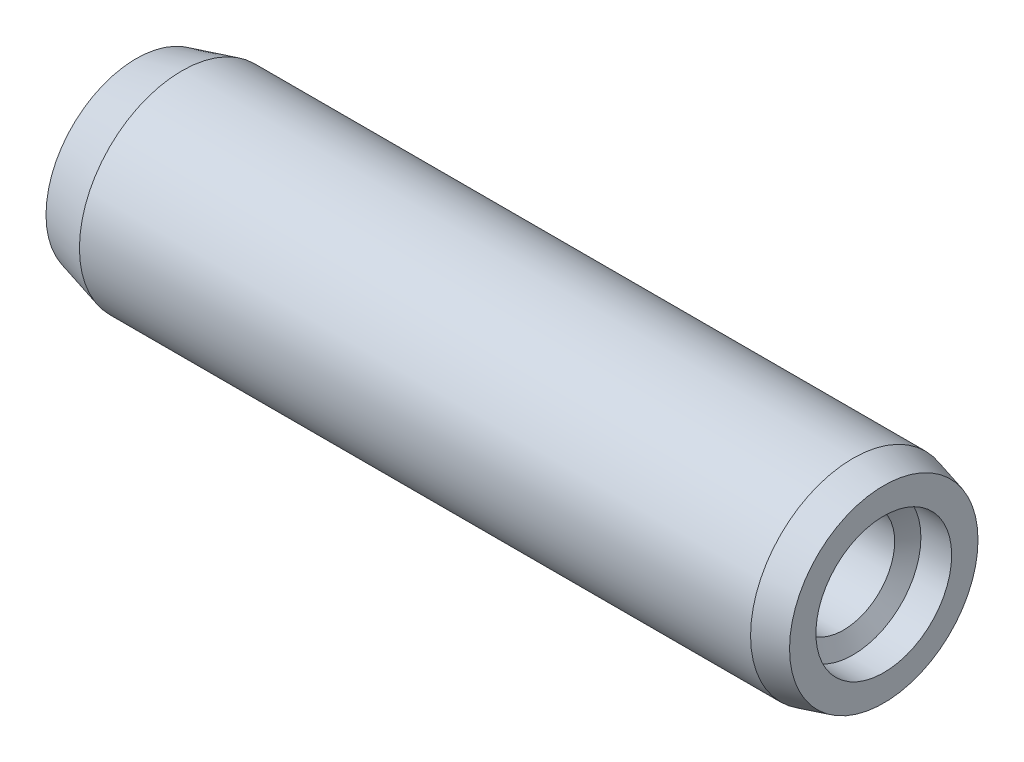
ISO-10303-21;
HEADER;
FILE_DESCRIPTION(('STEP AP214'),'2;1');
FILE_NAME('part.step','',(''),(''),'','','');
FILE_SCHEMA(('AUTOMOTIVE_DESIGN { 1 0 10303 214 1 1 1 1 }'));
ENDSEC;
DATA;
#1=APPLICATION_CONTEXT('core data for automotive mechanical design processes');
#2=APPLICATION_PROTOCOL_DEFINITION('international standard','automotive_design',2000,#1);
#3=PRODUCT_CONTEXT('',#1,'mechanical');
#4=PRODUCT('Part','Part','',(#3));
#5=PRODUCT_RELATED_PRODUCT_CATEGORY('part','',(#4));
#6=PRODUCT_DEFINITION_FORMATION('','',#4);
#7=PRODUCT_DEFINITION_CONTEXT('part definition',#1,'design');
#8=PRODUCT_DEFINITION('design','',#6,#7);
#9=PRODUCT_DEFINITION_SHAPE('','',#8);
#10=(LENGTH_UNIT() NAMED_UNIT(*) SI_UNIT(.MILLI.,.METRE.));
#11=(NAMED_UNIT(*) PLANE_ANGLE_UNIT() SI_UNIT($,.RADIAN.));
#12=(NAMED_UNIT(*) SI_UNIT($,.STERADIAN.) SOLID_ANGLE_UNIT());
#13=UNCERTAINTY_MEASURE_WITH_UNIT(LENGTH_MEASURE(1.E-05),#10,'distance_accuracy_value','');
#14=(GEOMETRIC_REPRESENTATION_CONTEXT(3) GLOBAL_UNCERTAINTY_ASSIGNED_CONTEXT((#13)) GLOBAL_UNIT_ASSIGNED_CONTEXT((#10,
#11,#12)) REPRESENTATION_CONTEXT('',''));
#15=CARTESIAN_POINT('',(0.,0.,0.));
#16=DIRECTION('',(0.,0.,1.));
#17=DIRECTION('',(1.,0.,0.));
#18=AXIS2_PLACEMENT_3D('',#15,#16,#17);
#19=CARTESIAN_POINT('',(8.,0.,0.));
#20=DIRECTION('',(0.,0.,1.00000000000001));
#21=DIRECTION('',(1.,0.,0.));
#22=AXIS2_PLACEMENT_3D('',#19,#20,#21);
#23=SPHERICAL_SURFACE('',#22,8.);
#24=CARTESIAN_POINT('',(8.,0.,0.));
#25=DIRECTION('',(-1.,0.,0.));
#26=DIRECTION('',(0.,0.,1.));
#27=AXIS2_PLACEMENT_3D('',#24,#25,#26);
#28=SPHERICAL_SURFACE('',#27,8.);
#29=CARTESIAN_POINT('',(0.817137041249985,0.,0.));
#30=DIRECTION('',(-1.,0.,0.));
#31=DIRECTION('',(0.,0.,1.00000000000001));
#32=AXIS2_PLACEMENT_3D('',#29,#30,#31);
#33=CIRCLE('',#32,3.52228330998757);
#34=CARTESIAN_POINT('',(0.817137041249985,0.,3.52228330998762));
#35=VERTEX_POINT('',#34);
#36=EDGE_CURVE('E58',#35,#35,#33,.T.);
#37=ORIENTED_EDGE('',*,*,#36,.T.);
#38=EDGE_LOOP('',(#37));
#39=FACE_BOUND('',#38,.T.);
#40=ADVANCED_FACE('F38',(#39),#28,.T.);
#41=CARTESIAN_POINT('',(30.,3.67846096908273,3.33066907387547E-13));
#42=DIRECTION('',(-1.,0.,0.));
#43=DIRECTION('',(0.,0.,1.00000000000001));
#44=AXIS2_PLACEMENT_3D('',#41,#42,#43);
#45=PLANE('',#44);
#46=CARTESIAN_POINT('',(30.0000000000001,0.,1.66533453693773E-13));
#47=DIRECTION('',(1.,0.,0.));
#48=DIRECTION('',(0.,0.,-1.00000000000001));
#49=AXIS2_PLACEMENT_3D('',#46,#47,#48);
#50=CIRCLE('',#49,2.65);
#51=CARTESIAN_POINT('',(30.0000000000001,0.,-2.64999999999987));
#52=VERTEX_POINT('',#51);
#53=EDGE_CURVE('E64',#52,#52,#50,.T.);
#54=ORIENTED_EDGE('',*,*,#53,.F.);
#55=EDGE_LOOP('',(#54));
#56=FACE_BOUND('',#55,.T.);
#57=CARTESIAN_POINT('',(30.0000000000001,0.,1.66533453693773E-13));
#58=DIRECTION('',(-1.,0.,0.));
#59=DIRECTION('',(0.,0.,1.00000000000001));
#60=AXIS2_PLACEMENT_3D('',#57,#58,#59);
#61=CIRCLE('',#60,3.67846096908265);
#62=CARTESIAN_POINT('',(30.0000000000001,0.,3.67846096908286));
#63=VERTEX_POINT('',#62);
#64=EDGE_CURVE('E11',#63,#63,#61,.T.);
#65=ORIENTED_EDGE('',*,*,#64,.F.);
#66=EDGE_LOOP('',(#65));
#67=FACE_BOUND('',#66,.T.);
#68=ADVANCED_FACE('F78',(#56,#67),#45,.F.);
#69=CARTESIAN_POINT('',(30.0000000000001,0.,1.66533453693773E-13));
#70=DIRECTION('',(-1.,0.,0.));
#71=DIRECTION('',(0.,0.,1.00000000000001));
#72=AXIS2_PLACEMENT_3D('',#69,#70,#71);
#73=CONICAL_SURFACE('',#72,3.67846096908265,0.261799387799152);
#74=CARTESIAN_POINT('',(28.8000000000001,0.,1.66533453693773E-13));
#75=DIRECTION('',(-1.,0.,0.));
#76=DIRECTION('',(0.,0.,1.00000000000001));
#77=AXIS2_PLACEMENT_3D('',#74,#75,#76);
#78=CIRCLE('',#77,4.);
#79=CARTESIAN_POINT('',(28.8000000000001,0.,4.00000000000022));
#80=VERTEX_POINT('',#79);
#81=EDGE_CURVE('E45',#80,#80,#78,.T.);
#82=ORIENTED_EDGE('',*,*,#81,.F.);
#83=EDGE_LOOP('',(#82));
#84=FACE_BOUND('',#83,.T.);
#85=ORIENTED_EDGE('',*,*,#64,.T.);
#86=EDGE_LOOP('',(#85));
#87=FACE_BOUND('',#86,.T.);
#88=ADVANCED_FACE('F75',(#84,#87),#73,.T.);
#89=CARTESIAN_POINT('',(-7.06251541307028,0.,2.22044604925031E-13));
#90=DIRECTION('',(-1.,0.,0.));
#91=DIRECTION('',(0.,0.,1.00000000000001));
#92=AXIS2_PLACEMENT_3D('',#89,#90,#91);
#93=CYLINDRICAL_SURFACE('',#92,4.);
#94=CARTESIAN_POINT('',(2.6,0.,0.));
#95=DIRECTION('',(-1.,0.,0.));
#96=DIRECTION('',(0.,0.,1.00000000000001));
#97=AXIS2_PLACEMENT_3D('',#94,#95,#96);
#98=CIRCLE('',#97,4.);
#99=CARTESIAN_POINT('',(2.6,0.,4.00000000000005));
#100=VERTEX_POINT('',#99);
#101=EDGE_CURVE('E61',#100,#100,#98,.T.);
#102=ORIENTED_EDGE('',*,*,#101,.F.);
#103=EDGE_LOOP('',(#102));
#104=FACE_BOUND('',#103,.T.);
#105=ORIENTED_EDGE('',*,*,#81,.T.);
#106=EDGE_LOOP('',(#105));
#107=FACE_BOUND('',#106,.T.);
#108=ADVANCED_FACE('F73',(#104,#107),#93,.T.);
#109=CARTESIAN_POINT('',(2.6,0.,0.));
#110=DIRECTION('',(1.,0.,0.));
#111=DIRECTION('',(0.,0.,-1.00000000000001));
#112=AXIS2_PLACEMENT_3D('',#109,#110,#111);
#113=CONICAL_SURFACE('',#112,4.,0.26179938779915);
#114=ORIENTED_EDGE('',*,*,#36,.F.);
#115=EDGE_LOOP('',(#114));
#116=FACE_BOUND('',#115,.T.);
#117=ORIENTED_EDGE('',*,*,#101,.T.);
#118=EDGE_LOOP('',(#117));
#119=FACE_BOUND('',#118,.T.);
#120=ADVANCED_FACE('F92',(#116,#119),#113,.T.);
#121=CARTESIAN_POINT('',(28.8000000000001,0.,1.66533453693773E-13));
#122=DIRECTION('',(1.,0.,0.));
#123=DIRECTION('',(0.,0.,-1.00000000000001));
#124=AXIS2_PLACEMENT_3D('',#121,#122,#123);
#125=CONICAL_SURFACE('',#124,2.65,1.0471975511966);
#126=CARTESIAN_POINT('',(28.8000000000001,0.,1.66533453693773E-13));
#127=DIRECTION('',(1.,0.,0.));
#128=DIRECTION('',(0.,0.,-1.00000000000001));
#129=AXIS2_PLACEMENT_3D('',#126,#127,#128);
#130=CIRCLE('',#129,2.65);
#131=CARTESIAN_POINT('',(28.8000000000001,0.,-2.64999999999987));
#132=VERTEX_POINT('',#131);
#133=EDGE_CURVE('E111',#132,#132,#130,.T.);
#134=ORIENTED_EDGE('',*,*,#133,.T.);
#135=EDGE_LOOP('',(#134));
#136=FACE_BOUND('',#135,.T.);
#137=CARTESIAN_POINT('',(28.4247223250268,0.,1.66533453693773E-13));
#138=DIRECTION('',(1.,0.,0.));
#139=DIRECTION('',(0.,0.,-1.00000000000001));
#140=AXIS2_PLACEMENT_3D('',#137,#138,#139);
#141=CIRCLE('',#140,2.);
#142=CARTESIAN_POINT('',(28.4247223250268,0.,-1.99999999999986));
#143=VERTEX_POINT('',#142);
#144=EDGE_CURVE('E41',#143,#143,#141,.T.);
#145=ORIENTED_EDGE('',*,*,#144,.F.);
#146=EDGE_LOOP('',(#145));
#147=FACE_BOUND('',#146,.T.);
#148=ADVANCED_FACE('F95',(#136,#147),#125,.F.);
#149=CARTESIAN_POINT('',(30.0000000000001,0.,1.66533453693773E-13));
#150=DIRECTION('',(1.,0.,0.));
#151=DIRECTION('',(0.,0.,-1.00000000000001));
#152=AXIS2_PLACEMENT_3D('',#149,#150,#151);
#153=CYLINDRICAL_SURFACE('',#152,2.65);
#154=ORIENTED_EDGE('',*,*,#133,.F.);
#155=EDGE_LOOP('',(#154));
#156=FACE_BOUND('',#155,.T.);
#157=ORIENTED_EDGE('',*,*,#53,.T.);
#158=EDGE_LOOP('',(#157));
#159=FACE_BOUND('',#158,.T.);
#160=ADVANCED_FACE('F52',(#156,#159),#153,.F.);
#161=CARTESIAN_POINT('',(18.,0.,1.66533453693773E-13));
#162=DIRECTION('',(1.,0.,0.));
#163=DIRECTION('',(0.,0.,-1.00000000000001));
#164=AXIS2_PLACEMENT_3D('',#161,#162,#163);
#165=CONICAL_SURFACE('',#164,2.,1.0471975511966);
#166=CARTESIAN_POINT('',(16.8452994616208,0.,0.));
#167=VERTEX_POINT('',#166);
#168=VERTEX_LOOP('',#167);
#169=FACE_BOUND('',#168,.T.);
#170=CARTESIAN_POINT('',(18.,0.,1.66533453693773E-13));
#171=DIRECTION('',(1.,0.,0.));
#172=DIRECTION('',(0.,0.,-1.00000000000001));
#173=AXIS2_PLACEMENT_3D('',#170,#171,#172);
#174=CIRCLE('',#173,2.);
#175=CARTESIAN_POINT('',(18.,0.,-1.99999999999986));
#176=VERTEX_POINT('',#175);
#177=EDGE_CURVE('E56',#176,#176,#174,.T.);
#178=ORIENTED_EDGE('',*,*,#177,.T.);
#179=EDGE_LOOP('',(#178));
#180=FACE_BOUND('',#179,.T.);
#181=ADVANCED_FACE('F48',(#169,#180),#165,.F.);
#182=CARTESIAN_POINT('',(30.0000000000001,0.,1.66533453693773E-13));
#183=DIRECTION('',(1.,0.,0.));
#184=DIRECTION('',(0.,0.,-1.00000000000001));
#185=AXIS2_PLACEMENT_3D('',#182,#183,#184);
#186=CYLINDRICAL_SURFACE('',#185,2.);
#187=ORIENTED_EDGE('',*,*,#144,.T.);
#188=EDGE_LOOP('',(#187));
#189=FACE_BOUND('',#188,.T.);
#190=ORIENTED_EDGE('',*,*,#177,.F.);
#191=EDGE_LOOP('',(#190));
#192=FACE_BOUND('',#191,.T.);
#193=ADVANCED_FACE('F51',(#189,#192),#186,.F.);
#194=CLOSED_SHELL('',(#40,#68,#88,#108,#120,#148,#160,#181,#193));
#195=MANIFOLD_SOLID_BREP('B2',#194);
#196=ADVANCED_BREP_SHAPE_REPRESENTATION('',(#18,#195),#14);
#197=SHAPE_DEFINITION_REPRESENTATION(#9,#196);
ENDSEC;
END-ISO-10303-21;
